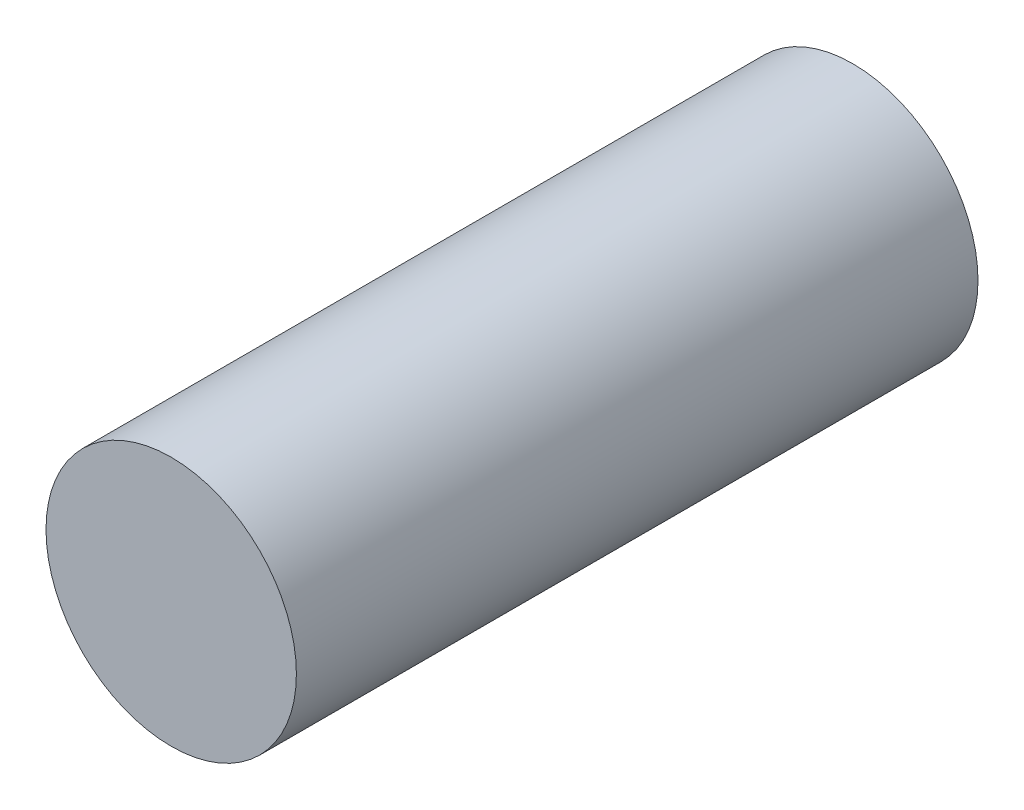
ISO-10303-21;
HEADER;
FILE_DESCRIPTION(('STEP AP214'),'2;1');
FILE_NAME('part.step','',(''),(''),'','','');
FILE_SCHEMA(('AUTOMOTIVE_DESIGN { 1 0 10303 214 1 1 1 1 }'));
ENDSEC;
DATA;
#1=APPLICATION_CONTEXT('core data for automotive mechanical design processes');
#2=APPLICATION_PROTOCOL_DEFINITION('international standard','automotive_design',2000,#1);
#3=PRODUCT_CONTEXT('',#1,'mechanical');
#4=PRODUCT('Part','Part','',(#3));
#5=PRODUCT_RELATED_PRODUCT_CATEGORY('part','',(#4));
#6=PRODUCT_DEFINITION_FORMATION('','',#4);
#7=PRODUCT_DEFINITION_CONTEXT('part definition',#1,'design');
#8=PRODUCT_DEFINITION('design','',#6,#7);
#9=PRODUCT_DEFINITION_SHAPE('','',#8);
#10=(LENGTH_UNIT() NAMED_UNIT(*) SI_UNIT(.MILLI.,.METRE.));
#11=(NAMED_UNIT(*) PLANE_ANGLE_UNIT() SI_UNIT($,.RADIAN.));
#12=(NAMED_UNIT(*) SI_UNIT($,.STERADIAN.) SOLID_ANGLE_UNIT());
#13=UNCERTAINTY_MEASURE_WITH_UNIT(LENGTH_MEASURE(1.E-05),#10,'distance_accuracy_value','');
#14=(GEOMETRIC_REPRESENTATION_CONTEXT(3) GLOBAL_UNCERTAINTY_ASSIGNED_CONTEXT((#13)) GLOBAL_UNIT_ASSIGNED_CONTEXT((#10,
#11,#12)) REPRESENTATION_CONTEXT('',''));
#15=CARTESIAN_POINT('',(0.,0.,0.));
#16=DIRECTION('',(0.,0.,1.));
#17=DIRECTION('',(1.,0.,0.));
#18=AXIS2_PLACEMENT_3D('',#15,#16,#17);
#19=CARTESIAN_POINT('',(0.,0.,98.));
#20=DIRECTION('',(0.,0.,-1.));
#21=DIRECTION('',(-1.,0.,0.));
#22=AXIS2_PLACEMENT_3D('',#19,#20,#21);
#23=CYLINDRICAL_SURFACE('',#22,18.);
#24=CARTESIAN_POINT('',(0.,0.,98.));
#25=DIRECTION('',(0.,0.,1.));
#26=DIRECTION('',(1.,0.,0.));
#27=AXIS2_PLACEMENT_3D('',#24,#25,#26);
#28=CIRCLE('',#27,18.);
#29=CARTESIAN_POINT('',(18.,0.,98.));
#30=VERTEX_POINT('',#29);
#31=EDGE_CURVE('E10',#30,#30,#28,.T.);
#32=ORIENTED_EDGE('',*,*,#31,.F.);
#33=EDGE_LOOP('',(#32));
#34=FACE_BOUND('',#33,.T.);
#35=CARTESIAN_POINT('',(0.,0.,0.));
#36=DIRECTION('',(0.,0.,1.));
#37=DIRECTION('',(1.,0.,0.));
#38=AXIS2_PLACEMENT_3D('',#35,#36,#37);
#39=CIRCLE('',#38,18.);
#40=CARTESIAN_POINT('',(18.,0.,0.));
#41=VERTEX_POINT('',#40);
#42=EDGE_CURVE('E40',#41,#41,#39,.T.);
#43=ORIENTED_EDGE('',*,*,#42,.T.);
#44=EDGE_LOOP('',(#43));
#45=FACE_BOUND('',#44,.T.);
#46=ADVANCED_FACE('F37',(#34,#45),#23,.T.);
#47=CARTESIAN_POINT('',(0.,0.,98.));
#48=DIRECTION('',(0.,0.,1.));
#49=DIRECTION('',(1.,0.,0.));
#50=AXIS2_PLACEMENT_3D('',#47,#48,#49);
#51=PLANE('',#50);
#52=ORIENTED_EDGE('',*,*,#31,.T.);
#53=EDGE_LOOP('',(#52));
#54=FACE_BOUND('',#53,.T.);
#55=ADVANCED_FACE('F54',(#54),#51,.T.);
#56=CARTESIAN_POINT('',(0.,0.,0.));
#57=DIRECTION('',(0.,0.,1.));
#58=DIRECTION('',(1.,0.,0.));
#59=AXIS2_PLACEMENT_3D('',#56,#57,#58);
#60=PLANE('',#59);
#61=ORIENTED_EDGE('',*,*,#42,.F.);
#62=EDGE_LOOP('',(#61));
#63=FACE_BOUND('',#62,.T.);
#64=ADVANCED_FACE('F52',(#63),#60,.F.);
#65=CLOSED_SHELL('',(#46,#55,#64));
#66=MANIFOLD_SOLID_BREP('B2',#65);
#67=ADVANCED_BREP_SHAPE_REPRESENTATION('',(#18,#66),#14);
#68=SHAPE_DEFINITION_REPRESENTATION(#9,#67);
ENDSEC;
END-ISO-10303-21;
